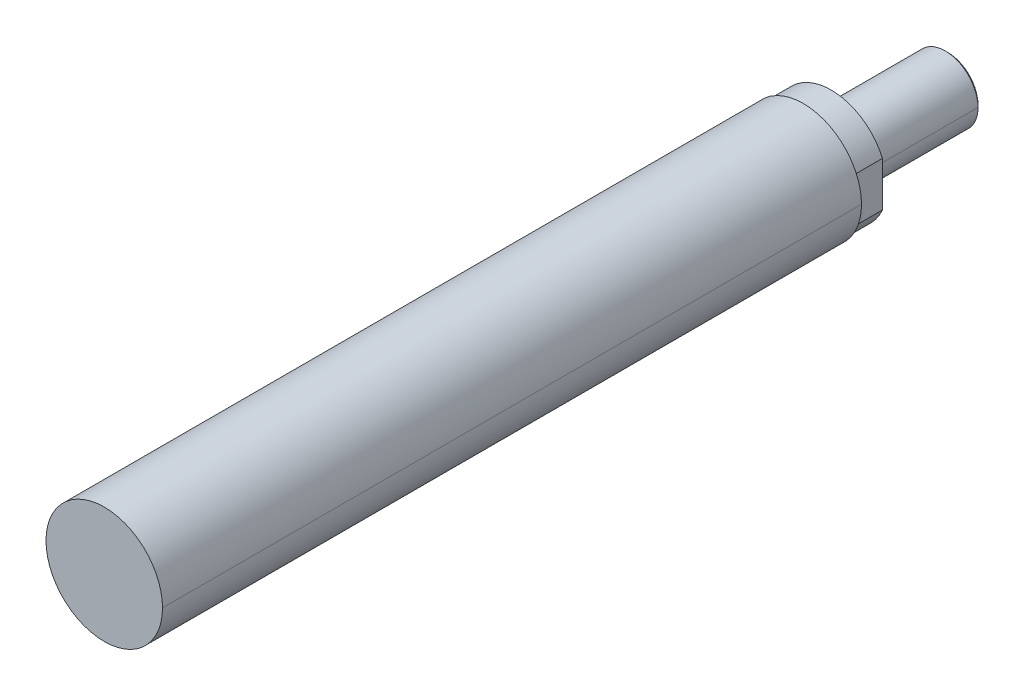
ISO-10303-21;
HEADER;
FILE_DESCRIPTION(('STEP AP214'),'2;1');
FILE_NAME('part.step','',(''),(''),'','','');
FILE_SCHEMA(('AUTOMOTIVE_DESIGN { 1 0 10303 214 1 1 1 1 }'));
ENDSEC;
DATA;
#1=APPLICATION_CONTEXT('core data for automotive mechanical design processes');
#2=APPLICATION_PROTOCOL_DEFINITION('international standard','automotive_design',2000,#1);
#3=PRODUCT_CONTEXT('',#1,'mechanical');
#4=PRODUCT('Part','Part','',(#3));
#5=PRODUCT_RELATED_PRODUCT_CATEGORY('part','',(#4));
#6=PRODUCT_DEFINITION_FORMATION('','',#4);
#7=PRODUCT_DEFINITION_CONTEXT('part definition',#1,'design');
#8=PRODUCT_DEFINITION('design','',#6,#7);
#9=PRODUCT_DEFINITION_SHAPE('','',#8);
#10=(LENGTH_UNIT() NAMED_UNIT(*) SI_UNIT(.MILLI.,.METRE.));
#11=(NAMED_UNIT(*) PLANE_ANGLE_UNIT() SI_UNIT($,.RADIAN.));
#12=(NAMED_UNIT(*) SI_UNIT($,.STERADIAN.) SOLID_ANGLE_UNIT());
#13=UNCERTAINTY_MEASURE_WITH_UNIT(LENGTH_MEASURE(1.E-05),#10,'distance_accuracy_value','');
#14=(GEOMETRIC_REPRESENTATION_CONTEXT(3) GLOBAL_UNCERTAINTY_ASSIGNED_CONTEXT((#13)) GLOBAL_UNIT_ASSIGNED_CONTEXT((#10,
#11,#12)) REPRESENTATION_CONTEXT('',''));
#15=CARTESIAN_POINT('',(0.,0.,0.));
#16=DIRECTION('',(0.,0.,1.));
#17=DIRECTION('',(1.,0.,0.));
#18=AXIS2_PLACEMENT_3D('',#15,#16,#17);
#19=CARTESIAN_POINT('',(0.,0.,25.));
#20=DIRECTION('',(0.,0.,-1.));
#21=DIRECTION('',(-1.,0.,0.));
#22=AXIS2_PLACEMENT_3D('',#19,#20,#21);
#23=CYLINDRICAL_SURFACE('',#22,7.);
#24=DIRECTION('',(0.,0.,-1.));
#25=VECTOR('',#24,1.);
#26=CARTESIAN_POINT('',(7.,0.,25.));
#27=LINE('',#26,#25);
#28=CARTESIAN_POINT('',(7.,0.,23.));
#29=VERTEX_POINT('',#28);
#30=CARTESIAN_POINT('',(7.,0.,0.500000000000007));
#31=VERTEX_POINT('',#30);
#32=EDGE_CURVE('E180',#29,#31,#27,.T.);
#33=ORIENTED_EDGE('',*,*,#32,.F.);
#34=CARTESIAN_POINT('',(0.,0.,23.));
#35=DIRECTION('',(0.,0.,-1.));
#36=DIRECTION('',(-1.,0.,0.));
#37=AXIS2_PLACEMENT_3D('',#34,#35,#36);
#38=CIRCLE('',#37,7.);
#39=CARTESIAN_POINT('',(-7.,0.,23.));
#40=VERTEX_POINT('',#39);
#41=EDGE_CURVE('E165',#29,#40,#38,.T.);
#42=ORIENTED_EDGE('',*,*,#41,.T.);
#43=DIRECTION('',(0.,0.,-1.));
#44=VECTOR('',#43,1.);
#45=CARTESIAN_POINT('',(-7.,0.,25.));
#46=LINE('',#45,#44);
#47=CARTESIAN_POINT('',(-7.,0.,0.500000000000007));
#48=VERTEX_POINT('',#47);
#49=EDGE_CURVE('E179',#40,#48,#46,.T.);
#50=ORIENTED_EDGE('',*,*,#49,.T.);
#51=CARTESIAN_POINT('',(0.,0.,0.500000000000007));
#52=DIRECTION('',(0.,0.,1.));
#53=DIRECTION('',(1.,0.,0.));
#54=AXIS2_PLACEMENT_3D('',#51,#52,#53);
#55=CIRCLE('',#54,7.);
#56=EDGE_CURVE('E11',#48,#31,#55,.T.);
#57=ORIENTED_EDGE('',*,*,#56,.T.);
#58=EDGE_LOOP('',(#33,#42,#50,#57));
#59=FACE_BOUND('',#58,.T.);
#60=ADVANCED_FACE('F17',(#59),#23,.T.);
#61=CARTESIAN_POINT('',(0.,0.,0.500000000000007));
#62=DIRECTION('',(0.,0.,1.));
#63=DIRECTION('',(1.,0.,0.));
#64=AXIS2_PLACEMENT_3D('',#61,#62,#63);
#65=CONICAL_SURFACE('',#64,7.,0.78539816339745);
#66=DIRECTION('',(-0.707106781186549,0.,0.707106781186546));
#67=VECTOR('',#66,1.);
#68=CARTESIAN_POINT('',(-7.,0.,0.500000000000007));
#69=LINE('',#68,#67);
#70=CARTESIAN_POINT('',(-6.5,0.,0.));
#71=VERTEX_POINT('',#70);
#72=EDGE_CURVE('E243',#71,#48,#69,.T.);
#73=ORIENTED_EDGE('',*,*,#72,.F.);
#74=CARTESIAN_POINT('',(0.,0.,0.));
#75=DIRECTION('',(0.,0.,-1.));
#76=DIRECTION('',(1.,0.,0.));
#77=AXIS2_PLACEMENT_3D('',#74,#75,#76);
#78=CIRCLE('',#77,6.5);
#79=CARTESIAN_POINT('',(6.5,0.,0.));
#80=VERTEX_POINT('',#79);
#81=EDGE_CURVE('E27',#80,#71,#78,.T.);
#82=ORIENTED_EDGE('',*,*,#81,.F.);
#83=DIRECTION('',(0.707106781186549,0.,0.707106781186546));
#84=VECTOR('',#83,1.);
#85=CARTESIAN_POINT('',(7.,0.,0.500000000000007));
#86=LINE('',#85,#84);
#87=EDGE_CURVE('E204',#80,#31,#86,.T.);
#88=ORIENTED_EDGE('',*,*,#87,.T.);
#89=ORIENTED_EDGE('',*,*,#56,.F.);
#90=EDGE_LOOP('',(#73,#82,#88,#89));
#91=FACE_BOUND('',#90,.T.);
#92=ADVANCED_FACE('F261',(#91),#65,.T.);
#93=CARTESIAN_POINT('',(0.,0.,0.));
#94=DIRECTION('',(0.,0.,1.));
#95=DIRECTION('',(1.,0.,0.));
#96=AXIS2_PLACEMENT_3D('',#93,#94,#95);
#97=PLANE('',#96);
#98=ORIENTED_EDGE('',*,*,#81,.T.);
#99=CARTESIAN_POINT('',(0.,0.,0.));
#100=DIRECTION('',(0.,0.,-1.));
#101=DIRECTION('',(1.,0.,0.));
#102=AXIS2_PLACEMENT_3D('',#99,#100,#101);
#103=CIRCLE('',#102,6.5);
#104=EDGE_CURVE('E218',#71,#80,#103,.T.);
#105=ORIENTED_EDGE('',*,*,#104,.T.);
#106=EDGE_LOOP('',(#98,#105));
#107=FACE_BOUND('',#106,.T.);
#108=ADVANCED_FACE('F390',(#107),#97,.F.);
#109=CARTESIAN_POINT('',(0.,0.,23.));
#110=DIRECTION('',(0.,0.,1.));
#111=DIRECTION('',(1.,0.,0.));
#112=AXIS2_PLACEMENT_3D('',#109,#110,#111);
#113=CYLINDRICAL_SURFACE('',#112,6.);
#114=DIRECTION('',(0.,0.,1.));
#115=VECTOR('',#114,1.);
#116=CARTESIAN_POINT('',(-6.,0.,23.));
#117=LINE('',#116,#115);
#118=CARTESIAN_POINT('',(-6.,0.,23.));
#119=VERTEX_POINT('',#118);
#120=CARTESIAN_POINT('',(-6.,0.,25.));
#121=VERTEX_POINT('',#120);
#122=EDGE_CURVE('E154',#119,#121,#117,.T.);
#123=ORIENTED_EDGE('',*,*,#122,.F.);
#124=CARTESIAN_POINT('',(0.,0.,23.));
#125=DIRECTION('',(0.,0.,-1.));
#126=DIRECTION('',(-1.,0.,0.));
#127=AXIS2_PLACEMENT_3D('',#124,#125,#126);
#128=CIRCLE('',#127,6.);
#129=CARTESIAN_POINT('',(6.,0.,23.));
#130=VERTEX_POINT('',#129);
#131=EDGE_CURVE('E146',#130,#119,#128,.T.);
#132=ORIENTED_EDGE('',*,*,#131,.F.);
#133=DIRECTION('',(0.,0.,1.));
#134=VECTOR('',#133,1.);
#135=CARTESIAN_POINT('',(6.,0.,23.));
#136=LINE('',#135,#134);
#137=CARTESIAN_POINT('',(6.,0.,25.));
#138=VERTEX_POINT('',#137);
#139=EDGE_CURVE('E144',#130,#138,#136,.T.);
#140=ORIENTED_EDGE('',*,*,#139,.T.);
#141=CARTESIAN_POINT('',(0.,0.,25.));
#142=DIRECTION('',(0.,0.,-1.));
#143=DIRECTION('',(-1.,0.,0.));
#144=AXIS2_PLACEMENT_3D('',#141,#142,#143);
#145=CIRCLE('',#144,6.);
#146=EDGE_CURVE('E133',#138,#121,#145,.T.);
#147=ORIENTED_EDGE('',*,*,#146,.T.);
#148=EDGE_LOOP('',(#123,#132,#140,#147));
#149=FACE_BOUND('',#148,.T.);
#150=ADVANCED_FACE('F145',(#149),#113,.T.);
#151=CARTESIAN_POINT('',(0.,0.,23.));
#152=DIRECTION('',(0.,0.,-1.));
#153=DIRECTION('',(0.,-1.,0.));
#154=AXIS2_PLACEMENT_3D('',#151,#152,#153);
#155=PLANE('',#154);
#156=ORIENTED_EDGE('',*,*,#131,.T.);
#157=CARTESIAN_POINT('',(0.,0.,23.));
#158=DIRECTION('',(0.,0.,-1.));
#159=DIRECTION('',(-1.,0.,0.));
#160=AXIS2_PLACEMENT_3D('',#157,#158,#159);
#161=CIRCLE('',#160,6.);
#162=EDGE_CURVE('E161',#119,#130,#161,.T.);
#163=ORIENTED_EDGE('',*,*,#162,.T.);
#164=EDGE_LOOP('',(#156,#163));
#165=FACE_BOUND('',#164,.T.);
#166=CARTESIAN_POINT('',(0.,0.,23.));
#167=DIRECTION('',(0.,0.,-1.));
#168=DIRECTION('',(-1.,0.,0.));
#169=AXIS2_PLACEMENT_3D('',#166,#167,#168);
#170=CIRCLE('',#169,7.);
#171=EDGE_CURVE('E181',#40,#29,#170,.T.);
#172=ORIENTED_EDGE('',*,*,#171,.F.);
#173=ORIENTED_EDGE('',*,*,#41,.F.);
#174=EDGE_LOOP('',(#172,#173));
#175=FACE_BOUND('',#174,.T.);
#176=ADVANCED_FACE('F19',(#165,#175),#155,.F.);
#177=CARTESIAN_POINT('',(0.,0.,181.));
#178=DIRECTION('',(0.,0.,1.));
#179=DIRECTION('',(1.,0.,0.));
#180=AXIS2_PLACEMENT_3D('',#177,#178,#179);
#181=PLANE('',#180);
#182=CARTESIAN_POINT('',(0.,0.,181.));
#183=DIRECTION('',(0.,0.,1.));
#184=DIRECTION('',(1.,0.,0.));
#185=AXIS2_PLACEMENT_3D('',#182,#183,#184);
#186=CIRCLE('',#185,12.5);
#187=CARTESIAN_POINT('',(-12.5,0.,181.));
#188=VERTEX_POINT('',#187);
#189=CARTESIAN_POINT('',(12.5,0.,181.));
#190=VERTEX_POINT('',#189);
#191=EDGE_CURVE('E174',#188,#190,#186,.T.);
#192=ORIENTED_EDGE('',*,*,#191,.T.);
#193=CARTESIAN_POINT('',(0.,0.,181.));
#194=DIRECTION('',(0.,0.,1.));
#195=DIRECTION('',(1.,0.,0.));
#196=AXIS2_PLACEMENT_3D('',#193,#194,#195);
#197=CIRCLE('',#196,12.5);
#198=EDGE_CURVE('E151',#190,#188,#197,.T.);
#199=ORIENTED_EDGE('',*,*,#198,.T.);
#200=EDGE_LOOP('',(#192,#199));
#201=FACE_BOUND('',#200,.T.);
#202=ADVANCED_FACE('F437',(#201),#181,.T.);
#203=CARTESIAN_POINT('',(0.,0.,181.));
#204=DIRECTION('',(0.,0.,-1.));
#205=DIRECTION('',(-1.,0.,0.));
#206=AXIS2_PLACEMENT_3D('',#203,#204,#205);
#207=CYLINDRICAL_SURFACE('',#206,12.5);
#208=DIRECTION('',(0.,0.,-1.));
#209=VECTOR('',#208,1.);
#210=CARTESIAN_POINT('',(12.5,0.,181.));
#211=LINE('',#210,#209);
#212=CARTESIAN_POINT('',(12.5,0.,31.));
#213=VERTEX_POINT('',#212);
#214=EDGE_CURVE('E211',#190,#213,#211,.T.);
#215=ORIENTED_EDGE('',*,*,#214,.F.);
#216=ORIENTED_EDGE('',*,*,#191,.F.);
#217=DIRECTION('',(0.,0.,-1.));
#218=VECTOR('',#217,1.);
#219=CARTESIAN_POINT('',(-12.5,0.,181.));
#220=LINE('',#219,#218);
#221=CARTESIAN_POINT('',(-12.5,0.,31.));
#222=VERTEX_POINT('',#221);
#223=EDGE_CURVE('E185',#188,#222,#220,.T.);
#224=ORIENTED_EDGE('',*,*,#223,.T.);
#225=CARTESIAN_POINT('',(0.,0.,31.));
#226=DIRECTION('',(0.,0.,1.));
#227=DIRECTION('',(1.,0.,0.));
#228=AXIS2_PLACEMENT_3D('',#225,#226,#227);
#229=CIRCLE('',#228,12.5);
#230=EDGE_CURVE('E171',#222,#213,#229,.T.);
#231=ORIENTED_EDGE('',*,*,#230,.T.);
#232=EDGE_LOOP('',(#215,#216,#224,#231));
#233=FACE_BOUND('',#232,.T.);
#234=ADVANCED_FACE('F404',(#233),#207,.T.);
#235=CARTESIAN_POINT('',(0.,0.,31.));
#236=DIRECTION('',(0.,0.,1.));
#237=DIRECTION('',(1.,0.,0.));
#238=AXIS2_PLACEMENT_3D('',#235,#236,#237);
#239=PLANE('',#238);
#240=CARTESIAN_POINT('',(0.,0.,31.));
#241=DIRECTION('',(0.,0.,1.));
#242=DIRECTION('',(1.,0.,0.));
#243=AXIS2_PLACEMENT_3D('',#240,#241,#242);
#244=CIRCLE('',#243,12.);
#245=CARTESIAN_POINT('',(11.,4.79583152331273,31.));
#246=VERTEX_POINT('',#245);
#247=CARTESIAN_POINT('',(-11.,4.79583152331273,31.));
#248=VERTEX_POINT('',#247);
#249=EDGE_CURVE('E170',#246,#248,#244,.T.);
#250=ORIENTED_EDGE('',*,*,#249,.T.);
#251=DIRECTION('',(0.,1.,0.));
#252=VECTOR('',#251,1.);
#253=CARTESIAN_POINT('',(-11.,0.,31.));
#254=LINE('',#253,#252);
#255=CARTESIAN_POINT('',(-11.,-4.79583152331273,31.));
#256=VERTEX_POINT('',#255);
#257=EDGE_CURVE('E41',#256,#248,#254,.T.);
#258=ORIENTED_EDGE('',*,*,#257,.F.);
#259=CARTESIAN_POINT('',(0.,0.,31.));
#260=DIRECTION('',(0.,0.,1.));
#261=DIRECTION('',(1.,0.,0.));
#262=AXIS2_PLACEMENT_3D('',#259,#260,#261);
#263=CIRCLE('',#262,12.);
#264=CARTESIAN_POINT('',(11.,-4.79583152331273,31.));
#265=VERTEX_POINT('',#264);
#266=EDGE_CURVE('E196',#256,#265,#263,.T.);
#267=ORIENTED_EDGE('',*,*,#266,.T.);
#268=DIRECTION('',(0.,1.,0.));
#269=VECTOR('',#268,1.);
#270=CARTESIAN_POINT('',(11.,0.,31.));
#271=LINE('',#270,#269);
#272=EDGE_CURVE('E21',#265,#246,#271,.T.);
#273=ORIENTED_EDGE('',*,*,#272,.T.);
#274=EDGE_LOOP('',(#250,#258,#267,#273));
#275=FACE_BOUND('',#274,.T.);
#276=ORIENTED_EDGE('',*,*,#230,.F.);
#277=CARTESIAN_POINT('',(0.,0.,31.));
#278=DIRECTION('',(0.,0.,1.));
#279=DIRECTION('',(1.,0.,0.));
#280=AXIS2_PLACEMENT_3D('',#277,#278,#279);
#281=CIRCLE('',#280,12.5);
#282=EDGE_CURVE('E190',#213,#222,#281,.T.);
#283=ORIENTED_EDGE('',*,*,#282,.F.);
#284=EDGE_LOOP('',(#276,#283));
#285=FACE_BOUND('',#284,.T.);
#286=ADVANCED_FACE('F399',(#275,#285),#239,.F.);
#287=CARTESIAN_POINT('',(11.,19.2905913248409,45.));
#288=DIRECTION('',(1.,0.,0.));
#289=DIRECTION('',(0.,1.,0.));
#290=AXIS2_PLACEMENT_3D('',#287,#288,#289);
#291=PLANE('',#290);
#292=DIRECTION('',(0.,0.,-1.));
#293=VECTOR('',#292,1.);
#294=CARTESIAN_POINT('',(11.,-4.79583152331273,31.));
#295=LINE('',#294,#293);
#296=CARTESIAN_POINT('',(11.,-4.79583152331273,25.));
#297=VERTEX_POINT('',#296);
#298=EDGE_CURVE('E189',#265,#297,#295,.T.);
#299=ORIENTED_EDGE('',*,*,#298,.T.);
#300=DIRECTION('',(0.,1.,0.));
#301=VECTOR('',#300,1.);
#302=CARTESIAN_POINT('',(11.,0.,25.));
#303=LINE('',#302,#301);
#304=CARTESIAN_POINT('',(11.,4.79583152331273,25.));
#305=VERTEX_POINT('',#304);
#306=EDGE_CURVE('E167',#297,#305,#303,.T.);
#307=ORIENTED_EDGE('',*,*,#306,.T.);
#308=DIRECTION('',(0.,0.,1.));
#309=VECTOR('',#308,1.);
#310=CARTESIAN_POINT('',(11.,4.79583152331273,31.));
#311=LINE('',#310,#309);
#312=EDGE_CURVE('E210',#305,#246,#311,.T.);
#313=ORIENTED_EDGE('',*,*,#312,.T.);
#314=ORIENTED_EDGE('',*,*,#272,.F.);
#315=EDGE_LOOP('',(#299,#307,#313,#314));
#316=FACE_BOUND('',#315,.T.);
#317=ADVANCED_FACE('F403',(#316),#291,.T.);
#318=CARTESIAN_POINT('',(-11.,19.2905913248409,45.));
#319=DIRECTION('',(1.,0.,0.));
#320=DIRECTION('',(0.,-1.,0.));
#321=AXIS2_PLACEMENT_3D('',#318,#319,#320);
#322=PLANE('',#321);
#323=ORIENTED_EDGE('',*,*,#257,.T.);
#324=DIRECTION('',(0.,0.,1.));
#325=VECTOR('',#324,1.);
#326=CARTESIAN_POINT('',(-11.,4.79583152331273,31.));
#327=LINE('',#326,#325);
#328=CARTESIAN_POINT('',(-11.,4.79583152331273,25.));
#329=VERTEX_POINT('',#328);
#330=EDGE_CURVE('E209',#329,#248,#327,.T.);
#331=ORIENTED_EDGE('',*,*,#330,.F.);
#332=DIRECTION('',(0.,1.,0.));
#333=VECTOR('',#332,1.);
#334=CARTESIAN_POINT('',(-11.,0.,25.));
#335=LINE('',#334,#333);
#336=CARTESIAN_POINT('',(-11.,-4.79583152331273,25.));
#337=VERTEX_POINT('',#336);
#338=EDGE_CURVE('E55',#337,#329,#335,.T.);
#339=ORIENTED_EDGE('',*,*,#338,.F.);
#340=DIRECTION('',(0.,0.,-1.));
#341=VECTOR('',#340,1.);
#342=CARTESIAN_POINT('',(-11.,-4.79583152331273,31.));
#343=LINE('',#342,#341);
#344=EDGE_CURVE('E197',#256,#337,#343,.T.);
#345=ORIENTED_EDGE('',*,*,#344,.F.);
#346=EDGE_LOOP('',(#323,#331,#339,#345));
#347=FACE_BOUND('',#346,.T.);
#348=ADVANCED_FACE('F414',(#347),#322,.F.);
#349=CARTESIAN_POINT('',(0.,0.,25.));
#350=DIRECTION('',(0.,0.,1.));
#351=DIRECTION('',(1.,0.,0.));
#352=AXIS2_PLACEMENT_3D('',#349,#350,#351);
#353=PLANE('',#352);
#354=ORIENTED_EDGE('',*,*,#146,.F.);
#355=CARTESIAN_POINT('',(0.,0.,25.));
#356=DIRECTION('',(0.,0.,-1.));
#357=DIRECTION('',(-1.,0.,0.));
#358=AXIS2_PLACEMENT_3D('',#355,#356,#357);
#359=CIRCLE('',#358,6.);
#360=EDGE_CURVE('E137',#121,#138,#359,.T.);
#361=ORIENTED_EDGE('',*,*,#360,.F.);
#362=EDGE_LOOP('',(#354,#361));
#363=FACE_BOUND('',#362,.T.);
#364=ORIENTED_EDGE('',*,*,#306,.F.);
#365=CARTESIAN_POINT('',(0.,0.,25.));
#366=DIRECTION('',(0.,0.,1.));
#367=DIRECTION('',(1.,0.,0.));
#368=AXIS2_PLACEMENT_3D('',#365,#366,#367);
#369=CIRCLE('',#368,12.);
#370=EDGE_CURVE('E201',#337,#297,#369,.T.);
#371=ORIENTED_EDGE('',*,*,#370,.F.);
#372=ORIENTED_EDGE('',*,*,#338,.T.);
#373=CARTESIAN_POINT('',(0.,0.,25.));
#374=DIRECTION('',(0.,0.,1.));
#375=DIRECTION('',(1.,0.,0.));
#376=AXIS2_PLACEMENT_3D('',#373,#374,#375);
#377=CIRCLE('',#376,12.);
#378=EDGE_CURVE('E205',#305,#329,#377,.T.);
#379=ORIENTED_EDGE('',*,*,#378,.F.);
#380=EDGE_LOOP('',(#364,#371,#372,#379));
#381=FACE_BOUND('',#380,.T.);
#382=ADVANCED_FACE('F135',(#363,#381),#353,.F.);
#383=CARTESIAN_POINT('',(0.,0.,31.));
#384=DIRECTION('',(0.,0.,-1.));
#385=DIRECTION('',(-1.,0.,0.));
#386=AXIS2_PLACEMENT_3D('',#383,#384,#385);
#387=CYLINDRICAL_SURFACE('',#386,12.);
#388=ORIENTED_EDGE('',*,*,#312,.F.);
#389=ORIENTED_EDGE('',*,*,#378,.T.);
#390=ORIENTED_EDGE('',*,*,#330,.T.);
#391=ORIENTED_EDGE('',*,*,#249,.F.);
#392=EDGE_LOOP('',(#388,#389,#390,#391));
#393=FACE_BOUND('',#392,.T.);
#394=ADVANCED_FACE('F413',(#393),#387,.T.);
#395=CARTESIAN_POINT('',(0.,0.,31.));
#396=DIRECTION('',(0.,0.,-1.));
#397=DIRECTION('',(-1.,0.,0.));
#398=AXIS2_PLACEMENT_3D('',#395,#396,#397);
#399=CYLINDRICAL_SURFACE('',#398,12.);
#400=ORIENTED_EDGE('',*,*,#298,.F.);
#401=ORIENTED_EDGE('',*,*,#266,.F.);
#402=ORIENTED_EDGE('',*,*,#344,.T.);
#403=ORIENTED_EDGE('',*,*,#370,.T.);
#404=EDGE_LOOP('',(#400,#401,#402,#403));
#405=FACE_BOUND('',#404,.T.);
#406=ADVANCED_FACE('F497',(#405),#399,.T.);
#407=CARTESIAN_POINT('',(0.,0.,181.));
#408=DIRECTION('',(0.,0.,-1.));
#409=DIRECTION('',(-1.,0.,0.));
#410=AXIS2_PLACEMENT_3D('',#407,#408,#409);
#411=CYLINDRICAL_SURFACE('',#410,12.5);
#412=ORIENTED_EDGE('',*,*,#198,.F.);
#413=ORIENTED_EDGE('',*,*,#214,.T.);
#414=ORIENTED_EDGE('',*,*,#282,.T.);
#415=ORIENTED_EDGE('',*,*,#223,.F.);
#416=EDGE_LOOP('',(#412,#413,#414,#415));
#417=FACE_BOUND('',#416,.T.);
#418=ADVANCED_FACE('F429',(#417),#411,.T.);
#419=CARTESIAN_POINT('',(0.,0.,23.));
#420=DIRECTION('',(0.,0.,1.));
#421=DIRECTION('',(1.,0.,0.));
#422=AXIS2_PLACEMENT_3D('',#419,#420,#421);
#423=CYLINDRICAL_SURFACE('',#422,6.);
#424=ORIENTED_EDGE('',*,*,#162,.F.);
#425=ORIENTED_EDGE('',*,*,#122,.T.);
#426=ORIENTED_EDGE('',*,*,#360,.T.);
#427=ORIENTED_EDGE('',*,*,#139,.F.);
#428=EDGE_LOOP('',(#424,#425,#426,#427));
#429=FACE_BOUND('',#428,.T.);
#430=ADVANCED_FACE('F153',(#429),#423,.T.);
#431=CARTESIAN_POINT('',(0.,0.,0.500000000000007));
#432=DIRECTION('',(0.,0.,1.));
#433=DIRECTION('',(1.,0.,0.));
#434=AXIS2_PLACEMENT_3D('',#431,#432,#433);
#435=CONICAL_SURFACE('',#434,7.,0.78539816339745);
#436=ORIENTED_EDGE('',*,*,#104,.F.);
#437=ORIENTED_EDGE('',*,*,#72,.T.);
#438=CARTESIAN_POINT('',(0.,0.,0.500000000000007));
#439=DIRECTION('',(0.,0.,1.));
#440=DIRECTION('',(1.,0.,0.));
#441=AXIS2_PLACEMENT_3D('',#438,#439,#440);
#442=CIRCLE('',#441,7.);
#443=EDGE_CURVE('E175',#31,#48,#442,.T.);
#444=ORIENTED_EDGE('',*,*,#443,.F.);
#445=ORIENTED_EDGE('',*,*,#87,.F.);
#446=EDGE_LOOP('',(#436,#437,#444,#445));
#447=FACE_BOUND('',#446,.T.);
#448=ADVANCED_FACE('F264',(#447),#435,.T.);
#449=CARTESIAN_POINT('',(0.,0.,25.));
#450=DIRECTION('',(0.,0.,-1.));
#451=DIRECTION('',(-1.,0.,0.));
#452=AXIS2_PLACEMENT_3D('',#449,#450,#451);
#453=CYLINDRICAL_SURFACE('',#452,7.);
#454=ORIENTED_EDGE('',*,*,#171,.T.);
#455=ORIENTED_EDGE('',*,*,#32,.T.);
#456=ORIENTED_EDGE('',*,*,#443,.T.);
#457=ORIENTED_EDGE('',*,*,#49,.F.);
#458=EDGE_LOOP('',(#454,#455,#456,#457));
#459=FACE_BOUND('',#458,.T.);
#460=ADVANCED_FACE('F268',(#459),#453,.T.);
#461=CLOSED_SHELL('',(#60,#92,#108,#150,#176,#202,#234,#286,#317,#348,#382,#394,#406,#418,#430,
#448,#460));
#462=MANIFOLD_SOLID_BREP('B1',#461);
#463=ADVANCED_BREP_SHAPE_REPRESENTATION('',(#18,#462),#14);
#464=SHAPE_DEFINITION_REPRESENTATION(#9,#463);
ENDSEC;
END-ISO-10303-21;
